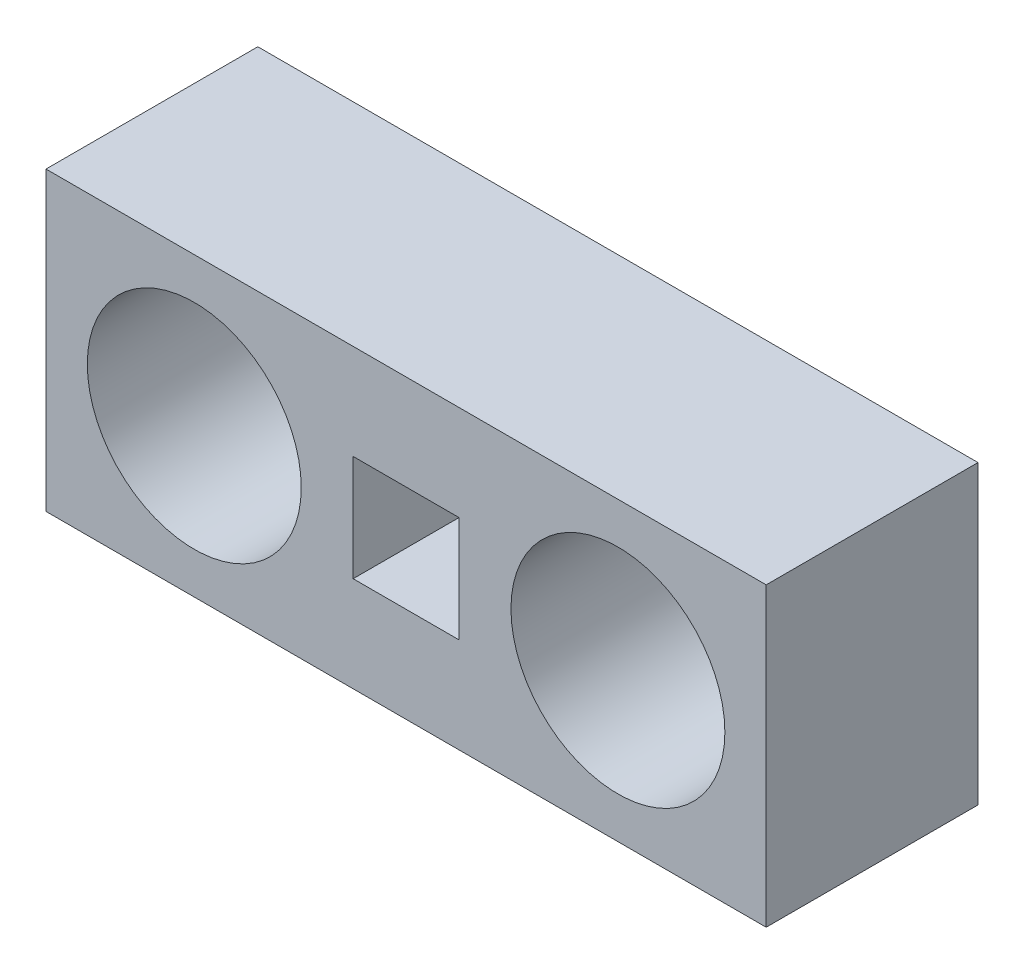
ISO-10303-21;
HEADER;
FILE_DESCRIPTION(('STEP AP214'),'2;1');
FILE_NAME('part.step','',(''),(''),'','','');
FILE_SCHEMA(('AUTOMOTIVE_DESIGN { 1 0 10303 214 1 1 1 1 }'));
ENDSEC;
DATA;
#1=APPLICATION_CONTEXT('core data for automotive mechanical design processes');
#2=APPLICATION_PROTOCOL_DEFINITION('international standard','automotive_design',2000,#1);
#3=PRODUCT_CONTEXT('',#1,'mechanical');
#4=PRODUCT('Part','Part','',(#3));
#5=PRODUCT_RELATED_PRODUCT_CATEGORY('part','',(#4));
#6=PRODUCT_DEFINITION_FORMATION('','',#4);
#7=PRODUCT_DEFINITION_CONTEXT('part definition',#1,'design');
#8=PRODUCT_DEFINITION('design','',#6,#7);
#9=PRODUCT_DEFINITION_SHAPE('','',#8);
#10=(LENGTH_UNIT() NAMED_UNIT(*) SI_UNIT(.MILLI.,.METRE.));
#11=(NAMED_UNIT(*) PLANE_ANGLE_UNIT() SI_UNIT($,.RADIAN.));
#12=(NAMED_UNIT(*) SI_UNIT($,.STERADIAN.) SOLID_ANGLE_UNIT());
#13=UNCERTAINTY_MEASURE_WITH_UNIT(LENGTH_MEASURE(1.E-05),#10,'distance_accuracy_value','');
#14=(GEOMETRIC_REPRESENTATION_CONTEXT(3) GLOBAL_UNCERTAINTY_ASSIGNED_CONTEXT((#13)) GLOBAL_UNIT_ASSIGNED_CONTEXT((#10,
#11,#12)) REPRESENTATION_CONTEXT('',''));
#15=CARTESIAN_POINT('',(0.,0.,0.));
#16=DIRECTION('',(0.,0.,1.));
#17=DIRECTION('',(1.,0.,0.));
#18=AXIS2_PLACEMENT_3D('',#15,#16,#17);
#19=CARTESIAN_POINT('',(0.,0.,10.));
#20=DIRECTION('',(0.,0.,-1.));
#21=DIRECTION('',(-1.,0.,0.));
#22=AXIS2_PLACEMENT_3D('',#19,#20,#21);
#23=PLANE('',#22);
#24=CARTESIAN_POINT('',(10.,0.,10.));
#25=DIRECTION('',(0.,0.,1.));
#26=DIRECTION('',(1.,0.,0.));
#27=AXIS2_PLACEMENT_3D('',#24,#25,#26);
#28=CIRCLE('',#27,5.05);
#29=CARTESIAN_POINT('',(15.05,0.,10.));
#30=VERTEX_POINT('',#29);
#31=EDGE_CURVE('E153',#30,#30,#28,.T.);
#32=ORIENTED_EDGE('',*,*,#31,.F.);
#33=EDGE_LOOP('',(#32));
#34=FACE_BOUND('',#33,.T.);
#35=CARTESIAN_POINT('',(-10.,0.,10.));
#36=DIRECTION('',(0.,0.,1.));
#37=DIRECTION('',(1.,0.,0.));
#38=AXIS2_PLACEMENT_3D('',#35,#36,#37);
#39=CIRCLE('',#38,5.05);
#40=CARTESIAN_POINT('',(-4.95,0.,10.));
#41=VERTEX_POINT('',#40);
#42=EDGE_CURVE('E161',#41,#41,#39,.T.);
#43=ORIENTED_EDGE('',*,*,#42,.F.);
#44=EDGE_LOOP('',(#43));
#45=FACE_BOUND('',#44,.T.);
#46=DIRECTION('',(0.,-1.,0.));
#47=VECTOR('',#46,1.);
#48=CARTESIAN_POINT('',(-17.,7.,10.));
#49=LINE('',#48,#47);
#50=CARTESIAN_POINT('',(-17.,7.,10.));
#51=VERTEX_POINT('',#50);
#52=CARTESIAN_POINT('',(-17.,-7.,10.));
#53=VERTEX_POINT('',#52);
#54=EDGE_CURVE('E169',#51,#53,#49,.T.);
#55=ORIENTED_EDGE('',*,*,#54,.T.);
#56=DIRECTION('',(1.,0.,0.));
#57=VECTOR('',#56,1.);
#58=CARTESIAN_POINT('',(17.,-7.,10.));
#59=LINE('',#58,#57);
#60=CARTESIAN_POINT('',(17.,-7.,10.));
#61=VERTEX_POINT('',#60);
#62=EDGE_CURVE('E173',#53,#61,#59,.T.);
#63=ORIENTED_EDGE('',*,*,#62,.T.);
#64=DIRECTION('',(0.,1.,0.));
#65=VECTOR('',#64,1.);
#66=CARTESIAN_POINT('',(17.,7.,10.));
#67=LINE('',#66,#65);
#68=CARTESIAN_POINT('',(17.,7.,10.));
#69=VERTEX_POINT('',#68);
#70=EDGE_CURVE('E177',#61,#69,#67,.T.);
#71=ORIENTED_EDGE('',*,*,#70,.T.);
#72=DIRECTION('',(-1.,0.,0.));
#73=VECTOR('',#72,1.);
#74=CARTESIAN_POINT('',(17.,7.,10.));
#75=LINE('',#74,#73);
#76=EDGE_CURVE('E180',#69,#51,#75,.T.);
#77=ORIENTED_EDGE('',*,*,#76,.T.);
#78=EDGE_LOOP('',(#55,#63,#71,#77));
#79=FACE_BOUND('',#78,.T.);
#80=DIRECTION('',(0.,1.,0.));
#81=VECTOR('',#80,1.);
#82=CARTESIAN_POINT('',(2.5,2.5,10.));
#83=LINE('',#82,#81);
#84=CARTESIAN_POINT('',(2.5,-2.5,10.));
#85=VERTEX_POINT('',#84);
#86=CARTESIAN_POINT('',(2.5,2.5,10.));
#87=VERTEX_POINT('',#86);
#88=EDGE_CURVE('E105',#85,#87,#83,.T.);
#89=ORIENTED_EDGE('',*,*,#88,.F.);
#90=DIRECTION('',(1.,0.,0.));
#91=VECTOR('',#90,1.);
#92=CARTESIAN_POINT('',(-2.5,-2.5,10.));
#93=LINE('',#92,#91);
#94=CARTESIAN_POINT('',(-2.5,-2.5,10.));
#95=VERTEX_POINT('',#94);
#96=EDGE_CURVE('E131',#95,#85,#93,.T.);
#97=ORIENTED_EDGE('',*,*,#96,.F.);
#98=DIRECTION('',(0.,-1.,0.));
#99=VECTOR('',#98,1.);
#100=CARTESIAN_POINT('',(-2.5,2.5,10.));
#101=LINE('',#100,#99);
#102=CARTESIAN_POINT('',(-2.5,2.5,10.));
#103=VERTEX_POINT('',#102);
#104=EDGE_CURVE('E127',#103,#95,#101,.T.);
#105=ORIENTED_EDGE('',*,*,#104,.F.);
#106=DIRECTION('',(-1.,0.,0.));
#107=VECTOR('',#106,1.);
#108=CARTESIAN_POINT('',(-2.5,2.5,10.));
#109=LINE('',#108,#107);
#110=EDGE_CURVE('E114',#87,#103,#109,.T.);
#111=ORIENTED_EDGE('',*,*,#110,.F.);
#112=EDGE_LOOP('',(#89,#97,#105,#111));
#113=FACE_BOUND('',#112,.T.);
#114=ADVANCED_FACE('F39',(#34,#45,#79,#113),#23,.F.);
#115=CARTESIAN_POINT('',(0.,0.,0.));
#116=DIRECTION('',(0.,0.,-1.));
#117=DIRECTION('',(-1.,0.,0.));
#118=AXIS2_PLACEMENT_3D('',#115,#116,#117);
#119=PLANE('',#118);
#120=CARTESIAN_POINT('',(-10.,0.,0.));
#121=DIRECTION('',(0.,0.,1.));
#122=DIRECTION('',(1.,0.,0.));
#123=AXIS2_PLACEMENT_3D('',#120,#121,#122);
#124=CIRCLE('',#123,5.05);
#125=CARTESIAN_POINT('',(-4.95,0.,0.));
#126=VERTEX_POINT('',#125);
#127=EDGE_CURVE('E157',#126,#126,#124,.T.);
#128=ORIENTED_EDGE('',*,*,#127,.T.);
#129=EDGE_LOOP('',(#128));
#130=FACE_BOUND('',#129,.T.);
#131=DIRECTION('',(0.,-1.,0.));
#132=VECTOR('',#131,1.);
#133=CARTESIAN_POINT('',(-17.,7.,0.));
#134=LINE('',#133,#132);
#135=CARTESIAN_POINT('',(-17.,7.,0.));
#136=VERTEX_POINT('',#135);
#137=CARTESIAN_POINT('',(-17.,-7.,0.));
#138=VERTEX_POINT('',#137);
#139=EDGE_CURVE('E165',#136,#138,#134,.T.);
#140=ORIENTED_EDGE('',*,*,#139,.F.);
#141=DIRECTION('',(-1.,0.,0.));
#142=VECTOR('',#141,1.);
#143=CARTESIAN_POINT('',(17.,7.,0.));
#144=LINE('',#143,#142);
#145=CARTESIAN_POINT('',(17.,7.,0.));
#146=VERTEX_POINT('',#145);
#147=EDGE_CURVE('E174',#146,#136,#144,.T.);
#148=ORIENTED_EDGE('',*,*,#147,.F.);
#149=DIRECTION('',(0.,1.,0.));
#150=VECTOR('',#149,1.);
#151=CARTESIAN_POINT('',(17.,7.,0.));
#152=LINE('',#151,#150);
#153=CARTESIAN_POINT('',(17.,-7.,0.));
#154=VERTEX_POINT('',#153);
#155=EDGE_CURVE('E190',#154,#146,#152,.T.);
#156=ORIENTED_EDGE('',*,*,#155,.F.);
#157=DIRECTION('',(1.,0.,0.));
#158=VECTOR('',#157,1.);
#159=CARTESIAN_POINT('',(17.,-7.,0.));
#160=LINE('',#159,#158);
#161=EDGE_CURVE('E187',#138,#154,#160,.T.);
#162=ORIENTED_EDGE('',*,*,#161,.F.);
#163=EDGE_LOOP('',(#140,#148,#156,#162));
#164=FACE_BOUND('',#163,.T.);
#165=CARTESIAN_POINT('',(10.,0.,0.));
#166=DIRECTION('',(0.,0.,1.));
#167=DIRECTION('',(1.,0.,0.));
#168=AXIS2_PLACEMENT_3D('',#165,#166,#167);
#169=CIRCLE('',#168,5.05);
#170=CARTESIAN_POINT('',(15.05,0.,0.));
#171=VERTEX_POINT('',#170);
#172=EDGE_CURVE('E123',#171,#171,#169,.T.);
#173=ORIENTED_EDGE('',*,*,#172,.T.);
#174=EDGE_LOOP('',(#173));
#175=FACE_BOUND('',#174,.T.);
#176=DIRECTION('',(1.,0.,0.));
#177=VECTOR('',#176,1.);
#178=CARTESIAN_POINT('',(-2.5,-2.5,0.));
#179=LINE('',#178,#177);
#180=CARTESIAN_POINT('',(-2.5,-2.5,0.));
#181=VERTEX_POINT('',#180);
#182=CARTESIAN_POINT('',(2.5,-2.5,0.));
#183=VERTEX_POINT('',#182);
#184=EDGE_CURVE('E115',#181,#183,#179,.T.);
#185=ORIENTED_EDGE('',*,*,#184,.T.);
#186=DIRECTION('',(0.,1.,0.));
#187=VECTOR('',#186,1.);
#188=CARTESIAN_POINT('',(2.5,2.5,0.));
#189=LINE('',#188,#187);
#190=CARTESIAN_POINT('',(2.5,2.5,0.));
#191=VERTEX_POINT('',#190);
#192=EDGE_CURVE('E63',#183,#191,#189,.T.);
#193=ORIENTED_EDGE('',*,*,#192,.T.);
#194=DIRECTION('',(-1.,0.,0.));
#195=VECTOR('',#194,1.);
#196=CARTESIAN_POINT('',(-2.5,2.5,0.));
#197=LINE('',#196,#195);
#198=CARTESIAN_POINT('',(-2.5,2.5,0.));
#199=VERTEX_POINT('',#198);
#200=EDGE_CURVE('E121',#191,#199,#197,.T.);
#201=ORIENTED_EDGE('',*,*,#200,.T.);
#202=DIRECTION('',(0.,-1.,0.));
#203=VECTOR('',#202,1.);
#204=CARTESIAN_POINT('',(-2.5,2.5,0.));
#205=LINE('',#204,#203);
#206=EDGE_CURVE('E140',#199,#181,#205,.T.);
#207=ORIENTED_EDGE('',*,*,#206,.T.);
#208=EDGE_LOOP('',(#185,#193,#201,#207));
#209=FACE_BOUND('',#208,.T.);
#210=ADVANCED_FACE('F213',(#130,#164,#175,#209),#119,.T.);
#211=CARTESIAN_POINT('',(-17.,7.,10.));
#212=DIRECTION('',(1.,0.,0.));
#213=DIRECTION('',(0.,0.,-1.));
#214=AXIS2_PLACEMENT_3D('',#211,#212,#213);
#215=PLANE('',#214);
#216=ORIENTED_EDGE('',*,*,#139,.T.);
#217=DIRECTION('',(0.,0.,-1.));
#218=VECTOR('',#217,1.);
#219=CARTESIAN_POINT('',(-17.,-7.,10.));
#220=LINE('',#219,#218);
#221=EDGE_CURVE('E11',#53,#138,#220,.T.);
#222=ORIENTED_EDGE('',*,*,#221,.F.);
#223=ORIENTED_EDGE('',*,*,#54,.F.);
#224=DIRECTION('',(0.,0.,-1.));
#225=VECTOR('',#224,1.);
#226=CARTESIAN_POINT('',(-17.,7.,10.));
#227=LINE('',#226,#225);
#228=EDGE_CURVE('E183',#51,#136,#227,.T.);
#229=ORIENTED_EDGE('',*,*,#228,.T.);
#230=EDGE_LOOP('',(#216,#222,#223,#229));
#231=FACE_BOUND('',#230,.T.);
#232=ADVANCED_FACE('F41',(#231),#215,.F.);
#233=CARTESIAN_POINT('',(17.,-7.,10.));
#234=DIRECTION('',(0.,1.,0.));
#235=DIRECTION('',(-1.,0.,0.));
#236=AXIS2_PLACEMENT_3D('',#233,#234,#235);
#237=PLANE('',#236);
#238=ORIENTED_EDGE('',*,*,#161,.T.);
#239=DIRECTION('',(0.,0.,-1.));
#240=VECTOR('',#239,1.);
#241=CARTESIAN_POINT('',(17.,-7.,10.));
#242=LINE('',#241,#240);
#243=EDGE_CURVE('E48',#61,#154,#242,.T.);
#244=ORIENTED_EDGE('',*,*,#243,.F.);
#245=ORIENTED_EDGE('',*,*,#62,.F.);
#246=ORIENTED_EDGE('',*,*,#221,.T.);
#247=EDGE_LOOP('',(#238,#244,#245,#246));
#248=FACE_BOUND('',#247,.T.);
#249=ADVANCED_FACE('F223',(#248),#237,.F.);
#250=CARTESIAN_POINT('',(17.,7.,10.));
#251=DIRECTION('',(-1.,0.,0.));
#252=DIRECTION('',(0.,0.,1.));
#253=AXIS2_PLACEMENT_3D('',#250,#251,#252);
#254=PLANE('',#253);
#255=ORIENTED_EDGE('',*,*,#155,.T.);
#256=DIRECTION('',(0.,0.,-1.));
#257=VECTOR('',#256,1.);
#258=CARTESIAN_POINT('',(17.,7.,10.));
#259=LINE('',#258,#257);
#260=EDGE_CURVE('E198',#69,#146,#259,.T.);
#261=ORIENTED_EDGE('',*,*,#260,.F.);
#262=ORIENTED_EDGE('',*,*,#70,.F.);
#263=ORIENTED_EDGE('',*,*,#243,.T.);
#264=EDGE_LOOP('',(#255,#261,#262,#263));
#265=FACE_BOUND('',#264,.T.);
#266=ADVANCED_FACE('F207',(#265),#254,.F.);
#267=CARTESIAN_POINT('',(17.,7.,10.));
#268=DIRECTION('',(0.,-1.,0.));
#269=DIRECTION('',(1.,0.,0.));
#270=AXIS2_PLACEMENT_3D('',#267,#268,#269);
#271=PLANE('',#270);
#272=ORIENTED_EDGE('',*,*,#147,.T.);
#273=ORIENTED_EDGE('',*,*,#228,.F.);
#274=ORIENTED_EDGE('',*,*,#76,.F.);
#275=ORIENTED_EDGE('',*,*,#260,.T.);
#276=EDGE_LOOP('',(#272,#273,#274,#275));
#277=FACE_BOUND('',#276,.T.);
#278=ADVANCED_FACE('F217',(#277),#271,.F.);
#279=CARTESIAN_POINT('',(-10.,0.,10.));
#280=DIRECTION('',(0.,0.,-1.));
#281=DIRECTION('',(-1.,0.,0.));
#282=AXIS2_PLACEMENT_3D('',#279,#280,#281);
#283=CYLINDRICAL_SURFACE('',#282,5.05);
#284=ORIENTED_EDGE('',*,*,#42,.T.);
#285=EDGE_LOOP('',(#284));
#286=FACE_BOUND('',#285,.T.);
#287=ORIENTED_EDGE('',*,*,#127,.F.);
#288=EDGE_LOOP('',(#287));
#289=FACE_BOUND('',#288,.T.);
#290=ADVANCED_FACE('F241',(#286,#289),#283,.F.);
#291=CARTESIAN_POINT('',(10.,0.,10.));
#292=DIRECTION('',(0.,0.,-1.));
#293=DIRECTION('',(-1.,0.,0.));
#294=AXIS2_PLACEMENT_3D('',#291,#292,#293);
#295=CYLINDRICAL_SURFACE('',#294,5.05);
#296=ORIENTED_EDGE('',*,*,#31,.T.);
#297=EDGE_LOOP('',(#296));
#298=FACE_BOUND('',#297,.T.);
#299=ORIENTED_EDGE('',*,*,#172,.F.);
#300=EDGE_LOOP('',(#299));
#301=FACE_BOUND('',#300,.T.);
#302=ADVANCED_FACE('F248',(#298,#301),#295,.F.);
#303=CARTESIAN_POINT('',(2.5,2.5,10.));
#304=DIRECTION('',(-1.,0.,0.));
#305=DIRECTION('',(0.,0.,1.));
#306=AXIS2_PLACEMENT_3D('',#303,#304,#305);
#307=PLANE('',#306);
#308=ORIENTED_EDGE('',*,*,#192,.F.);
#309=DIRECTION('',(0.,0.,-1.));
#310=VECTOR('',#309,1.);
#311=CARTESIAN_POINT('',(2.5,-2.5,10.));
#312=LINE('',#311,#310);
#313=EDGE_CURVE('E109',#85,#183,#312,.T.);
#314=ORIENTED_EDGE('',*,*,#313,.F.);
#315=ORIENTED_EDGE('',*,*,#88,.T.);
#316=DIRECTION('',(0.,0.,-1.));
#317=VECTOR('',#316,1.);
#318=CARTESIAN_POINT('',(2.5,2.5,10.));
#319=LINE('',#318,#317);
#320=EDGE_CURVE('E108',#87,#191,#319,.T.);
#321=ORIENTED_EDGE('',*,*,#320,.T.);
#322=EDGE_LOOP('',(#308,#314,#315,#321));
#323=FACE_BOUND('',#322,.T.);
#324=ADVANCED_FACE('F107',(#323),#307,.T.);
#325=CARTESIAN_POINT('',(-2.5,2.5,10.));
#326=DIRECTION('',(0.,-1.,0.));
#327=DIRECTION('',(0.,0.,-1.));
#328=AXIS2_PLACEMENT_3D('',#325,#326,#327);
#329=PLANE('',#328);
#330=ORIENTED_EDGE('',*,*,#200,.F.);
#331=ORIENTED_EDGE('',*,*,#320,.F.);
#332=ORIENTED_EDGE('',*,*,#110,.T.);
#333=DIRECTION('',(0.,0.,-1.));
#334=VECTOR('',#333,1.);
#335=CARTESIAN_POINT('',(-2.5,2.5,10.));
#336=LINE('',#335,#334);
#337=EDGE_CURVE('E124',#103,#199,#336,.T.);
#338=ORIENTED_EDGE('',*,*,#337,.T.);
#339=EDGE_LOOP('',(#330,#331,#332,#338));
#340=FACE_BOUND('',#339,.T.);
#341=ADVANCED_FACE('F118',(#340),#329,.T.);
#342=CARTESIAN_POINT('',(-2.5,2.5,10.));
#343=DIRECTION('',(1.,0.,0.));
#344=DIRECTION('',(0.,1.,0.));
#345=AXIS2_PLACEMENT_3D('',#342,#343,#344);
#346=PLANE('',#345);
#347=ORIENTED_EDGE('',*,*,#206,.F.);
#348=ORIENTED_EDGE('',*,*,#337,.F.);
#349=ORIENTED_EDGE('',*,*,#104,.T.);
#350=DIRECTION('',(0.,0.,-1.));
#351=VECTOR('',#350,1.);
#352=CARTESIAN_POINT('',(-2.5,-2.5,10.));
#353=LINE('',#352,#351);
#354=EDGE_CURVE('E55',#95,#181,#353,.T.);
#355=ORIENTED_EDGE('',*,*,#354,.T.);
#356=EDGE_LOOP('',(#347,#348,#349,#355));
#357=FACE_BOUND('',#356,.T.);
#358=ADVANCED_FACE('F265',(#357),#346,.T.);
#359=CARTESIAN_POINT('',(-2.5,-2.5,10.));
#360=DIRECTION('',(0.,1.,0.));
#361=DIRECTION('',(0.,0.,1.));
#362=AXIS2_PLACEMENT_3D('',#359,#360,#361);
#363=PLANE('',#362);
#364=ORIENTED_EDGE('',*,*,#184,.F.);
#365=ORIENTED_EDGE('',*,*,#354,.F.);
#366=ORIENTED_EDGE('',*,*,#96,.T.);
#367=ORIENTED_EDGE('',*,*,#313,.T.);
#368=EDGE_LOOP('',(#364,#365,#366,#367));
#369=FACE_BOUND('',#368,.T.);
#370=ADVANCED_FACE('F268',(#369),#363,.T.);
#371=CLOSED_SHELL('',(#114,#210,#232,#249,#266,#278,#290,#302,#324,#341,#358,#370));
#372=MANIFOLD_SOLID_BREP('B2',#371);
#373=ADVANCED_BREP_SHAPE_REPRESENTATION('',(#18,#372),#14);
#374=SHAPE_DEFINITION_REPRESENTATION(#9,#373);
ENDSEC;
END-ISO-10303-21;
